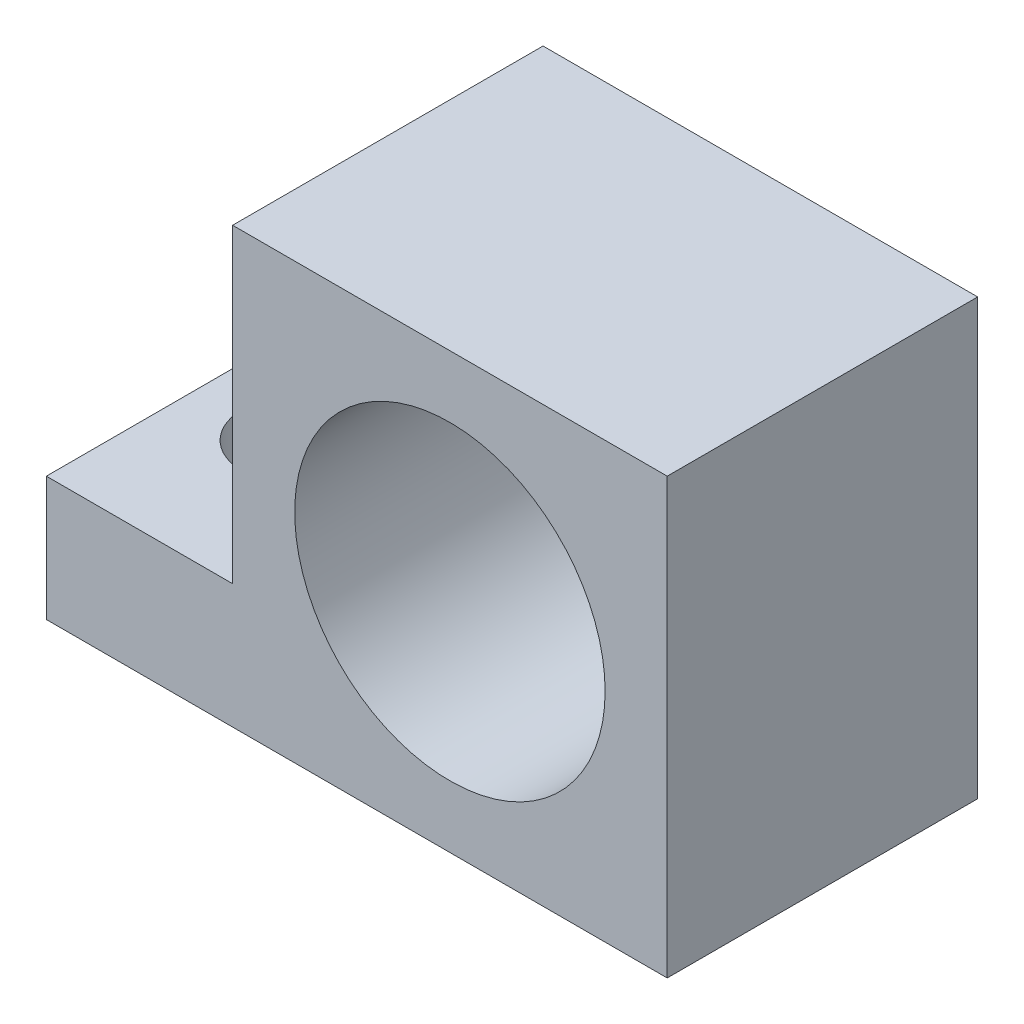
ISO-10303-21;
HEADER;
FILE_DESCRIPTION(('STEP AP214'),'2;1');
FILE_NAME('part.step','',(''),(''),'','','');
FILE_SCHEMA(('AUTOMOTIVE_DESIGN { 1 0 10303 214 1 1 1 1 }'));
ENDSEC;
DATA;
#1=APPLICATION_CONTEXT('core data for automotive mechanical design processes');
#2=APPLICATION_PROTOCOL_DEFINITION('international standard','automotive_design',2000,#1);
#3=PRODUCT_CONTEXT('',#1,'mechanical');
#4=PRODUCT('Part','Part','',(#3));
#5=PRODUCT_RELATED_PRODUCT_CATEGORY('part','',(#4));
#6=PRODUCT_DEFINITION_FORMATION('','',#4);
#7=PRODUCT_DEFINITION_CONTEXT('part definition',#1,'design');
#8=PRODUCT_DEFINITION('design','',#6,#7);
#9=PRODUCT_DEFINITION_SHAPE('','',#8);
#10=(LENGTH_UNIT() NAMED_UNIT(*) SI_UNIT(.MILLI.,.METRE.));
#11=(NAMED_UNIT(*) PLANE_ANGLE_UNIT() SI_UNIT($,.RADIAN.));
#12=(NAMED_UNIT(*) SI_UNIT($,.STERADIAN.) SOLID_ANGLE_UNIT());
#13=UNCERTAINTY_MEASURE_WITH_UNIT(LENGTH_MEASURE(1.E-05),#10,'distance_accuracy_value','');
#14=(GEOMETRIC_REPRESENTATION_CONTEXT(3) GLOBAL_UNCERTAINTY_ASSIGNED_CONTEXT((#13)) GLOBAL_UNIT_ASSIGNED_CONTEXT((#10,
#11,#12)) REPRESENTATION_CONTEXT('',''));
#15=CARTESIAN_POINT('',(0.,0.,0.));
#16=DIRECTION('',(0.,0.,1.));
#17=DIRECTION('',(1.,0.,0.));
#18=AXIS2_PLACEMENT_3D('',#15,#16,#17);
#19=CARTESIAN_POINT('',(0.,0.,10.));
#20=DIRECTION('',(0.,0.,1.));
#21=DIRECTION('',(1.,0.,0.));
#22=AXIS2_PLACEMENT_3D('',#19,#20,#21);
#23=PLANE('',#22);
#24=DIRECTION('',(0.,-1.,0.));
#25=VECTOR('',#24,1.);
#26=CARTESIAN_POINT('',(0.,4.,10.));
#27=LINE('',#26,#25);
#28=CARTESIAN_POINT('',(0.,4.,10.));
#29=VERTEX_POINT('',#28);
#30=CARTESIAN_POINT('',(0.,0.,10.));
#31=VERTEX_POINT('',#30);
#32=EDGE_CURVE('E127',#29,#31,#27,.T.);
#33=ORIENTED_EDGE('',*,*,#32,.T.);
#34=DIRECTION('',(1.,0.,0.));
#35=VECTOR('',#34,1.);
#36=CARTESIAN_POINT('',(0.,0.,10.));
#37=LINE('',#36,#35);
#38=CARTESIAN_POINT('',(20.,0.,10.));
#39=VERTEX_POINT('',#38);
#40=EDGE_CURVE('E85',#31,#39,#37,.T.);
#41=ORIENTED_EDGE('',*,*,#40,.T.);
#42=DIRECTION('',(0.,1.,0.));
#43=VECTOR('',#42,1.);
#44=CARTESIAN_POINT('',(20.,0.,10.));
#45=LINE('',#44,#43);
#46=CARTESIAN_POINT('',(20.,14.,10.));
#47=VERTEX_POINT('',#46);
#48=EDGE_CURVE('E98',#39,#47,#45,.T.);
#49=ORIENTED_EDGE('',*,*,#48,.T.);
#50=DIRECTION('',(-1.,0.,0.));
#51=VECTOR('',#50,1.);
#52=CARTESIAN_POINT('',(20.,14.,10.));
#53=LINE('',#52,#51);
#54=CARTESIAN_POINT('',(5.99999999999999,14.,10.));
#55=VERTEX_POINT('',#54);
#56=EDGE_CURVE('E92',#47,#55,#53,.T.);
#57=ORIENTED_EDGE('',*,*,#56,.T.);
#58=DIRECTION('',(0.,-1.,0.));
#59=VECTOR('',#58,1.);
#60=CARTESIAN_POINT('',(5.99999999999999,14.,10.));
#61=LINE('',#60,#59);
#62=CARTESIAN_POINT('',(6.,4.,10.));
#63=VERTEX_POINT('',#62);
#64=EDGE_CURVE('E96',#55,#63,#61,.T.);
#65=ORIENTED_EDGE('',*,*,#64,.T.);
#66=DIRECTION('',(-1.,0.,0.));
#67=VECTOR('',#66,1.);
#68=CARTESIAN_POINT('',(6.,4.,10.));
#69=LINE('',#68,#67);
#70=EDGE_CURVE('E48',#63,#29,#69,.T.);
#71=ORIENTED_EDGE('',*,*,#70,.T.);
#72=EDGE_LOOP('',(#33,#41,#49,#57,#65,#71));
#73=FACE_BOUND('',#72,.T.);
#74=CARTESIAN_POINT('',(13.,7.,10.));
#75=DIRECTION('',(0.,0.,1.));
#76=DIRECTION('',(1.,0.,0.));
#77=AXIS2_PLACEMENT_3D('',#74,#75,#76);
#78=CIRCLE('',#77,5.);
#79=CARTESIAN_POINT('',(18.,7.,10.));
#80=VERTEX_POINT('',#79);
#81=EDGE_CURVE('E120',#80,#80,#78,.T.);
#82=ORIENTED_EDGE('',*,*,#81,.F.);
#83=EDGE_LOOP('',(#82));
#84=FACE_BOUND('',#83,.T.);
#85=ADVANCED_FACE('F31',(#73,#84),#23,.T.);
#86=CARTESIAN_POINT('',(0.,0.,0.));
#87=DIRECTION('',(0.,0.,1.));
#88=DIRECTION('',(1.,0.,0.));
#89=AXIS2_PLACEMENT_3D('',#86,#87,#88);
#90=PLANE('',#89);
#91=DIRECTION('',(0.,-1.,0.));
#92=VECTOR('',#91,1.);
#93=CARTESIAN_POINT('',(0.,4.,0.));
#94=LINE('',#93,#92);
#95=CARTESIAN_POINT('',(0.,4.,0.));
#96=VERTEX_POINT('',#95);
#97=CARTESIAN_POINT('',(0.,0.,0.));
#98=VERTEX_POINT('',#97);
#99=EDGE_CURVE('E116',#96,#98,#94,.T.);
#100=ORIENTED_EDGE('',*,*,#99,.F.);
#101=DIRECTION('',(-1.,0.,0.));
#102=VECTOR('',#101,1.);
#103=CARTESIAN_POINT('',(6.,4.,0.));
#104=LINE('',#103,#102);
#105=CARTESIAN_POINT('',(6.,4.,0.));
#106=VERTEX_POINT('',#105);
#107=EDGE_CURVE('E77',#106,#96,#104,.T.);
#108=ORIENTED_EDGE('',*,*,#107,.F.);
#109=DIRECTION('',(0.,-1.,0.));
#110=VECTOR('',#109,1.);
#111=CARTESIAN_POINT('',(5.99999999999999,14.,0.));
#112=LINE('',#111,#110);
#113=CARTESIAN_POINT('',(5.99999999999999,14.,0.));
#114=VERTEX_POINT('',#113);
#115=EDGE_CURVE('E71',#114,#106,#112,.T.);
#116=ORIENTED_EDGE('',*,*,#115,.F.);
#117=DIRECTION('',(-1.,0.,0.));
#118=VECTOR('',#117,1.);
#119=CARTESIAN_POINT('',(20.,14.,0.));
#120=LINE('',#119,#118);
#121=CARTESIAN_POINT('',(20.,14.,0.));
#122=VERTEX_POINT('',#121);
#123=EDGE_CURVE('E106',#122,#114,#120,.T.);
#124=ORIENTED_EDGE('',*,*,#123,.F.);
#125=DIRECTION('',(0.,1.,0.));
#126=VECTOR('',#125,1.);
#127=CARTESIAN_POINT('',(20.,0.,0.));
#128=LINE('',#127,#126);
#129=CARTESIAN_POINT('',(20.,0.,0.));
#130=VERTEX_POINT('',#129);
#131=EDGE_CURVE('E122',#130,#122,#128,.T.);
#132=ORIENTED_EDGE('',*,*,#131,.F.);
#133=DIRECTION('',(1.,0.,0.));
#134=VECTOR('',#133,1.);
#135=CARTESIAN_POINT('',(0.,0.,0.));
#136=LINE('',#135,#134);
#137=EDGE_CURVE('E119',#98,#130,#136,.T.);
#138=ORIENTED_EDGE('',*,*,#137,.F.);
#139=EDGE_LOOP('',(#100,#108,#116,#124,#132,#138));
#140=FACE_BOUND('',#139,.T.);
#141=CARTESIAN_POINT('',(13.,7.,0.));
#142=DIRECTION('',(0.,0.,1.));
#143=DIRECTION('',(1.,0.,0.));
#144=AXIS2_PLACEMENT_3D('',#141,#142,#143);
#145=CIRCLE('',#144,5.);
#146=CARTESIAN_POINT('',(18.,7.,0.));
#147=VERTEX_POINT('',#146);
#148=EDGE_CURVE('E173',#147,#147,#145,.T.);
#149=ORIENTED_EDGE('',*,*,#148,.T.);
#150=EDGE_LOOP('',(#149));
#151=FACE_BOUND('',#150,.T.);
#152=ADVANCED_FACE('F136',(#140,#151),#90,.F.);
#153=CARTESIAN_POINT('',(0.,4.,10.));
#154=DIRECTION('',(1.,0.,0.));
#155=DIRECTION('',(0.,1.,0.));
#156=AXIS2_PLACEMENT_3D('',#153,#154,#155);
#157=PLANE('',#156);
#158=ORIENTED_EDGE('',*,*,#99,.T.);
#159=DIRECTION('',(0.,0.,-1.));
#160=VECTOR('',#159,1.);
#161=CARTESIAN_POINT('',(0.,0.,10.));
#162=LINE('',#161,#160);
#163=EDGE_CURVE('E11',#31,#98,#162,.T.);
#164=ORIENTED_EDGE('',*,*,#163,.F.);
#165=ORIENTED_EDGE('',*,*,#32,.F.);
#166=DIRECTION('',(0.,0.,-1.));
#167=VECTOR('',#166,1.);
#168=CARTESIAN_POINT('',(0.,4.,10.));
#169=LINE('',#168,#167);
#170=EDGE_CURVE('E112',#29,#96,#169,.T.);
#171=ORIENTED_EDGE('',*,*,#170,.T.);
#172=EDGE_LOOP('',(#158,#164,#165,#171));
#173=FACE_BOUND('',#172,.T.);
#174=ADVANCED_FACE('F33',(#173),#157,.F.);
#175=CARTESIAN_POINT('',(0.,0.,10.));
#176=DIRECTION('',(0.,1.,0.));
#177=DIRECTION('',(0.,0.,1.));
#178=AXIS2_PLACEMENT_3D('',#175,#176,#177);
#179=PLANE('',#178);
#180=CARTESIAN_POINT('',(3.,0.,5.));
#181=DIRECTION('',(0.,1.,0.));
#182=DIRECTION('',(0.,0.,1.));
#183=AXIS2_PLACEMENT_3D('',#180,#181,#182);
#184=CIRCLE('',#183,1.7);
#185=CARTESIAN_POINT('',(3.,0.,6.7));
#186=VERTEX_POINT('',#185);
#187=EDGE_CURVE('E169',#186,#186,#184,.T.);
#188=ORIENTED_EDGE('',*,*,#187,.T.);
#189=EDGE_LOOP('',(#188));
#190=FACE_BOUND('',#189,.T.);
#191=ORIENTED_EDGE('',*,*,#137,.T.);
#192=DIRECTION('',(0.,0.,-1.));
#193=VECTOR('',#192,1.);
#194=CARTESIAN_POINT('',(20.,0.,10.));
#195=LINE('',#194,#193);
#196=EDGE_CURVE('E40',#39,#130,#195,.T.);
#197=ORIENTED_EDGE('',*,*,#196,.F.);
#198=ORIENTED_EDGE('',*,*,#40,.F.);
#199=ORIENTED_EDGE('',*,*,#163,.T.);
#200=EDGE_LOOP('',(#191,#197,#198,#199));
#201=FACE_BOUND('',#200,.T.);
#202=ADVANCED_FACE('F185',(#190,#201),#179,.F.);
#203=CARTESIAN_POINT('',(20.,0.,10.));
#204=DIRECTION('',(-1.,0.,0.));
#205=DIRECTION('',(0.,-1.,0.));
#206=AXIS2_PLACEMENT_3D('',#203,#204,#205);
#207=PLANE('',#206);
#208=ORIENTED_EDGE('',*,*,#131,.T.);
#209=DIRECTION('',(0.,0.,-1.));
#210=VECTOR('',#209,1.);
#211=CARTESIAN_POINT('',(20.,14.,10.));
#212=LINE('',#211,#210);
#213=EDGE_CURVE('E107',#47,#122,#212,.T.);
#214=ORIENTED_EDGE('',*,*,#213,.F.);
#215=ORIENTED_EDGE('',*,*,#48,.F.);
#216=ORIENTED_EDGE('',*,*,#196,.T.);
#217=EDGE_LOOP('',(#208,#214,#215,#216));
#218=FACE_BOUND('',#217,.T.);
#219=ADVANCED_FACE('F133',(#218),#207,.F.);
#220=CARTESIAN_POINT('',(20.,14.,10.));
#221=DIRECTION('',(0.,-1.,0.));
#222=DIRECTION('',(0.,0.,-1.));
#223=AXIS2_PLACEMENT_3D('',#220,#221,#222);
#224=PLANE('',#223);
#225=ORIENTED_EDGE('',*,*,#123,.T.);
#226=DIRECTION('',(0.,0.,-1.));
#227=VECTOR('',#226,1.);
#228=CARTESIAN_POINT('',(5.99999999999999,14.,10.));
#229=LINE('',#228,#227);
#230=EDGE_CURVE('E103',#55,#114,#229,.T.);
#231=ORIENTED_EDGE('',*,*,#230,.F.);
#232=ORIENTED_EDGE('',*,*,#56,.F.);
#233=ORIENTED_EDGE('',*,*,#213,.T.);
#234=EDGE_LOOP('',(#225,#231,#232,#233));
#235=FACE_BOUND('',#234,.T.);
#236=ADVANCED_FACE('F104',(#235),#224,.F.);
#237=CARTESIAN_POINT('',(5.99999999999999,14.,10.));
#238=DIRECTION('',(1.,0.,0.));
#239=DIRECTION('',(0.,1.,0.));
#240=AXIS2_PLACEMENT_3D('',#237,#238,#239);
#241=PLANE('',#240);
#242=ORIENTED_EDGE('',*,*,#115,.T.);
#243=DIRECTION('',(0.,0.,-1.));
#244=VECTOR('',#243,1.);
#245=CARTESIAN_POINT('',(6.,4.,10.));
#246=LINE('',#245,#244);
#247=EDGE_CURVE('E108',#63,#106,#246,.T.);
#248=ORIENTED_EDGE('',*,*,#247,.F.);
#249=ORIENTED_EDGE('',*,*,#64,.F.);
#250=ORIENTED_EDGE('',*,*,#230,.T.);
#251=EDGE_LOOP('',(#242,#248,#249,#250));
#252=FACE_BOUND('',#251,.T.);
#253=ADVANCED_FACE('F110',(#252),#241,.F.);
#254=CARTESIAN_POINT('',(6.,4.,10.));
#255=DIRECTION('',(0.,-1.,0.));
#256=DIRECTION('',(1.,0.,0.));
#257=AXIS2_PLACEMENT_3D('',#254,#255,#256);
#258=PLANE('',#257);
#259=CARTESIAN_POINT('',(3.,4.,5.));
#260=DIRECTION('',(0.,1.,0.));
#261=DIRECTION('',(0.,0.,1.));
#262=AXIS2_PLACEMENT_3D('',#259,#260,#261);
#263=CIRCLE('',#262,1.69999999999999);
#264=CARTESIAN_POINT('',(3.,4.,6.69999999999999));
#265=VERTEX_POINT('',#264);
#266=EDGE_CURVE('E171',#265,#265,#263,.T.);
#267=ORIENTED_EDGE('',*,*,#266,.F.);
#268=EDGE_LOOP('',(#267));
#269=FACE_BOUND('',#268,.T.);
#270=ORIENTED_EDGE('',*,*,#107,.T.);
#271=ORIENTED_EDGE('',*,*,#170,.F.);
#272=ORIENTED_EDGE('',*,*,#70,.F.);
#273=ORIENTED_EDGE('',*,*,#247,.T.);
#274=EDGE_LOOP('',(#270,#271,#272,#273));
#275=FACE_BOUND('',#274,.T.);
#276=ADVANCED_FACE('F141',(#269,#275),#258,.F.);
#277=CARTESIAN_POINT('',(13.,7.,10.));
#278=DIRECTION('',(0.,0.,-1.));
#279=DIRECTION('',(-1.,0.,0.));
#280=AXIS2_PLACEMENT_3D('',#277,#278,#279);
#281=CYLINDRICAL_SURFACE('',#280,5.);
#282=ORIENTED_EDGE('',*,*,#81,.T.);
#283=EDGE_LOOP('',(#282));
#284=FACE_BOUND('',#283,.T.);
#285=ORIENTED_EDGE('',*,*,#148,.F.);
#286=EDGE_LOOP('',(#285));
#287=FACE_BOUND('',#286,.T.);
#288=ADVANCED_FACE('F143',(#284,#287),#281,.F.);
#289=CARTESIAN_POINT('',(3.,4.,5.));
#290=DIRECTION('',(0.,1.,0.));
#291=DIRECTION('',(0.,0.,1.));
#292=AXIS2_PLACEMENT_3D('',#289,#290,#291);
#293=CYLINDRICAL_SURFACE('',#292,1.69999999999999);
#294=ORIENTED_EDGE('',*,*,#187,.F.);
#295=EDGE_LOOP('',(#294));
#296=FACE_BOUND('',#295,.T.);
#297=ORIENTED_EDGE('',*,*,#266,.T.);
#298=EDGE_LOOP('',(#297));
#299=FACE_BOUND('',#298,.T.);
#300=ADVANCED_FACE('F150',(#296,#299),#293,.F.);
#301=CLOSED_SHELL('',(#85,#152,#174,#202,#219,#236,#253,#276,#288,#300));
#302=MANIFOLD_SOLID_BREP('B2',#301);
#303=ADVANCED_BREP_SHAPE_REPRESENTATION('',(#18,#302),#14);
#304=SHAPE_DEFINITION_REPRESENTATION(#9,#303);
ENDSEC;
END-ISO-10303-21;
